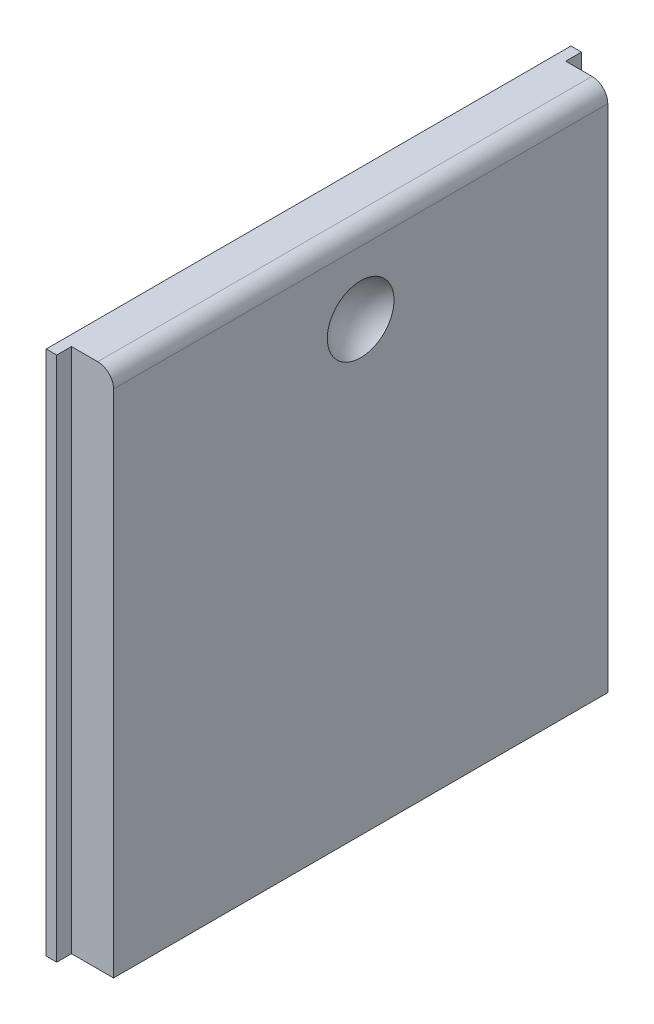
ISO-10303-21;
HEADER;
FILE_DESCRIPTION(('STEP AP214'),'2;1');
FILE_NAME('part.step','',(''),(''),'','','');
FILE_SCHEMA(('AUTOMOTIVE_DESIGN { 1 0 10303 214 1 1 1 1 }'));
ENDSEC;
DATA;
#1=APPLICATION_CONTEXT('core data for automotive mechanical design processes');
#2=APPLICATION_PROTOCOL_DEFINITION('international standard','automotive_design',2000,#1);
#3=PRODUCT_CONTEXT('',#1,'mechanical');
#4=PRODUCT('Part','Part','',(#3));
#5=PRODUCT_RELATED_PRODUCT_CATEGORY('part','',(#4));
#6=PRODUCT_DEFINITION_FORMATION('','',#4);
#7=PRODUCT_DEFINITION_CONTEXT('part definition',#1,'design');
#8=PRODUCT_DEFINITION('design','',#6,#7);
#9=PRODUCT_DEFINITION_SHAPE('','',#8);
#10=(LENGTH_UNIT() NAMED_UNIT(*) SI_UNIT(.MILLI.,.METRE.));
#11=(NAMED_UNIT(*) PLANE_ANGLE_UNIT() SI_UNIT($,.RADIAN.));
#12=(NAMED_UNIT(*) SI_UNIT($,.STERADIAN.) SOLID_ANGLE_UNIT());
#13=UNCERTAINTY_MEASURE_WITH_UNIT(LENGTH_MEASURE(1.E-05),#10,'distance_accuracy_value','');
#14=(GEOMETRIC_REPRESENTATION_CONTEXT(3) GLOBAL_UNCERTAINTY_ASSIGNED_CONTEXT((#13)) GLOBAL_UNIT_ASSIGNED_CONTEXT((#10,
#11,#12)) REPRESENTATION_CONTEXT('',''));
#15=CARTESIAN_POINT('',(0.,0.,0.));
#16=DIRECTION('',(0.,0.,1.));
#17=DIRECTION('',(1.,0.,0.));
#18=AXIS2_PLACEMENT_3D('',#15,#16,#17);
#19=CARTESIAN_POINT('',(0.,100.,47.));
#20=DIRECTION('',(-1.,0.,0.));
#21=DIRECTION('',(0.,0.,1.));
#22=AXIS2_PLACEMENT_3D('',#19,#20,#21);
#23=PLANE('',#22);
#24=CARTESIAN_POINT('',(0.,85.,0.));
#25=DIRECTION('',(-1.,0.,0.));
#26=DIRECTION('',(0.,0.,1.));
#27=AXIS2_PLACEMENT_3D('',#24,#25,#26);
#28=CIRCLE('',#27,6.34428877022475);
#29=CARTESIAN_POINT('',(0.,85.,6.34428877022475));
#30=VERTEX_POINT('',#29);
#31=EDGE_CURVE('E50',#30,#30,#28,.F.);
#32=ORIENTED_EDGE('',*,*,#31,.F.);
#33=EDGE_LOOP('',(#32));
#34=FACE_BOUND('',#33,.T.);
#35=DIRECTION('',(0.,-1.,0.));
#36=VECTOR('',#35,1.);
#37=CARTESIAN_POINT('',(0.,100.,-47.));
#38=LINE('',#37,#36);
#39=CARTESIAN_POINT('',(0.,97.,-47.));
#40=VERTEX_POINT('',#39);
#41=CARTESIAN_POINT('',(0.,0.,-47.));
#42=VERTEX_POINT('',#41);
#43=EDGE_CURVE('E136',#40,#42,#38,.T.);
#44=ORIENTED_EDGE('',*,*,#43,.F.);
#45=DIRECTION('',(0.,0.,-1.));
#46=VECTOR('',#45,1.);
#47=CARTESIAN_POINT('',(0.,97.,47.));
#48=LINE('',#47,#46);
#49=CARTESIAN_POINT('',(0.,97.,47.));
#50=VERTEX_POINT('',#49);
#51=EDGE_CURVE('E56',#40,#50,#48,.F.);
#52=ORIENTED_EDGE('',*,*,#51,.T.);
#53=DIRECTION('',(0.,-1.,0.));
#54=VECTOR('',#53,1.);
#55=CARTESIAN_POINT('',(0.,100.,47.));
#56=LINE('',#55,#54);
#57=CARTESIAN_POINT('',(0.,0.,47.));
#58=VERTEX_POINT('',#57);
#59=EDGE_CURVE('E162',#50,#58,#56,.T.);
#60=ORIENTED_EDGE('',*,*,#59,.T.);
#61=DIRECTION('',(0.,0.,-1.));
#62=VECTOR('',#61,1.);
#63=CARTESIAN_POINT('',(0.,0.,47.));
#64=LINE('',#63,#62);
#65=EDGE_CURVE('E163',#58,#42,#64,.T.);
#66=ORIENTED_EDGE('',*,*,#65,.T.);
#67=EDGE_LOOP('',(#44,#52,#60,#66));
#68=FACE_BOUND('',#67,.T.);
#69=ADVANCED_FACE('F46',(#34,#68),#23,.F.);
#70=CARTESIAN_POINT('',(0.,100.,-47.));
#71=DIRECTION('',(0.,0.,1.));
#72=DIRECTION('',(1.,0.,0.));
#73=AXIS2_PLACEMENT_3D('',#70,#71,#72);
#74=PLANE('',#73);
#75=DIRECTION('',(-1.,0.,0.));
#76=VECTOR('',#75,1.);
#77=CARTESIAN_POINT('',(0.,100.,-47.));
#78=LINE('',#77,#76);
#79=CARTESIAN_POINT('',(-3.,100.,-47.));
#80=VERTEX_POINT('',#79);
#81=CARTESIAN_POINT('',(-8.,100.,-47.));
#82=VERTEX_POINT('',#81);
#83=EDGE_CURVE('E116',#80,#82,#78,.T.);
#84=ORIENTED_EDGE('',*,*,#83,.F.);
#85=CARTESIAN_POINT('',(-3.,97.,-47.));
#86=DIRECTION('',(0.,0.,1.));
#87=DIRECTION('',(1.,0.,0.));
#88=AXIS2_PLACEMENT_3D('',#85,#86,#87);
#89=CIRCLE('',#88,3.);
#90=EDGE_CURVE('E70',#80,#40,#89,.F.);
#91=ORIENTED_EDGE('',*,*,#90,.T.);
#92=ORIENTED_EDGE('',*,*,#43,.T.);
#93=DIRECTION('',(-1.,0.,0.));
#94=VECTOR('',#93,1.);
#95=CARTESIAN_POINT('',(0.,0.,-47.));
#96=LINE('',#95,#94);
#97=CARTESIAN_POINT('',(-8.,0.,-47.));
#98=VERTEX_POINT('',#97);
#99=EDGE_CURVE('E132',#42,#98,#96,.T.);
#100=ORIENTED_EDGE('',*,*,#99,.T.);
#101=DIRECTION('',(0.,-1.,0.));
#102=VECTOR('',#101,1.);
#103=CARTESIAN_POINT('',(-8.,100.,-47.));
#104=LINE('',#103,#102);
#105=EDGE_CURVE('E129',#82,#98,#104,.T.);
#106=ORIENTED_EDGE('',*,*,#105,.F.);
#107=EDGE_LOOP('',(#84,#91,#92,#100,#106));
#108=FACE_BOUND('',#107,.T.);
#109=ADVANCED_FACE('F130',(#108),#74,.F.);
#110=CARTESIAN_POINT('',(-8.,100.,-47.));
#111=DIRECTION('',(-1.,0.,0.));
#112=DIRECTION('',(0.,0.,1.));
#113=AXIS2_PLACEMENT_3D('',#110,#111,#112);
#114=PLANE('',#113);
#115=DIRECTION('',(0.,0.,-1.));
#116=VECTOR('',#115,1.);
#117=CARTESIAN_POINT('',(-8.,0.,-47.));
#118=LINE('',#117,#116);
#119=CARTESIAN_POINT('',(-8.,0.,-50.));
#120=VERTEX_POINT('',#119);
#121=EDGE_CURVE('E169',#98,#120,#118,.T.);
#122=ORIENTED_EDGE('',*,*,#121,.T.);
#123=DIRECTION('',(0.,-1.,0.));
#124=VECTOR('',#123,1.);
#125=CARTESIAN_POINT('',(-8.,100.,-50.));
#126=LINE('',#125,#124);
#127=CARTESIAN_POINT('',(-8.,100.,-50.));
#128=VERTEX_POINT('',#127);
#129=EDGE_CURVE('E137',#128,#120,#126,.T.);
#130=ORIENTED_EDGE('',*,*,#129,.F.);
#131=DIRECTION('',(0.,0.,-1.));
#132=VECTOR('',#131,1.);
#133=CARTESIAN_POINT('',(-8.,100.,-47.));
#134=LINE('',#133,#132);
#135=EDGE_CURVE('E121',#82,#128,#134,.T.);
#136=ORIENTED_EDGE('',*,*,#135,.F.);
#137=ORIENTED_EDGE('',*,*,#105,.T.);
#138=EDGE_LOOP('',(#122,#130,#136,#137));
#139=FACE_BOUND('',#138,.T.);
#140=ADVANCED_FACE('F139',(#139),#114,.F.);
#141=CARTESIAN_POINT('',(-10.,100.,-50.));
#142=DIRECTION('',(0.,0.,1.));
#143=DIRECTION('',(1.,0.,0.));
#144=AXIS2_PLACEMENT_3D('',#141,#142,#143);
#145=PLANE('',#144);
#146=DIRECTION('',(-1.,0.,0.));
#147=VECTOR('',#146,1.);
#148=CARTESIAN_POINT('',(-10.,0.,-50.));
#149=LINE('',#148,#147);
#150=CARTESIAN_POINT('',(-10.,0.,-50.));
#151=VERTEX_POINT('',#150);
#152=EDGE_CURVE('E172',#120,#151,#149,.T.);
#153=ORIENTED_EDGE('',*,*,#152,.T.);
#154=DIRECTION('',(0.,-1.,0.));
#155=VECTOR('',#154,1.);
#156=CARTESIAN_POINT('',(-10.,100.,-50.));
#157=LINE('',#156,#155);
#158=CARTESIAN_POINT('',(-10.,100.,-50.));
#159=VERTEX_POINT('',#158);
#160=EDGE_CURVE('E202',#159,#151,#157,.T.);
#161=ORIENTED_EDGE('',*,*,#160,.F.);
#162=DIRECTION('',(-1.,0.,0.));
#163=VECTOR('',#162,1.);
#164=CARTESIAN_POINT('',(-10.,100.,-50.));
#165=LINE('',#164,#163);
#166=EDGE_CURVE('E143',#128,#159,#165,.T.);
#167=ORIENTED_EDGE('',*,*,#166,.F.);
#168=ORIENTED_EDGE('',*,*,#129,.T.);
#169=EDGE_LOOP('',(#153,#161,#167,#168));
#170=FACE_BOUND('',#169,.T.);
#171=ADVANCED_FACE('F295',(#170),#145,.F.);
#172=CARTESIAN_POINT('',(-9.99999999999998,100.,47.4));
#173=DIRECTION('',(1.,0.,0.));
#174=DIRECTION('',(0.,0.,-1.));
#175=AXIS2_PLACEMENT_3D('',#172,#173,#174);
#176=PLANE('',#175);
#177=DIRECTION('',(0.,0.,1.));
#178=VECTOR('',#177,1.);
#179=CARTESIAN_POINT('',(-9.99999999999998,0.,47.4));
#180=LINE('',#179,#178);
#181=CARTESIAN_POINT('',(-9.99999999999998,0.,49.8));
#182=VERTEX_POINT('',#181);
#183=EDGE_CURVE('E176',#151,#182,#180,.T.);
#184=ORIENTED_EDGE('',*,*,#183,.T.);
#185=DIRECTION('',(0.,-1.,0.));
#186=VECTOR('',#185,1.);
#187=CARTESIAN_POINT('',(-9.99999999999998,100.,49.8));
#188=LINE('',#187,#186);
#189=CARTESIAN_POINT('',(-9.99999999999998,100.,49.8));
#190=VERTEX_POINT('',#189);
#191=EDGE_CURVE('E198',#190,#182,#188,.T.);
#192=ORIENTED_EDGE('',*,*,#191,.F.);
#193=DIRECTION('',(0.,0.,1.));
#194=VECTOR('',#193,1.);
#195=CARTESIAN_POINT('',(-10.,100.,-47.6));
#196=LINE('',#195,#194);
#197=EDGE_CURVE('E148',#159,#190,#196,.T.);
#198=ORIENTED_EDGE('',*,*,#197,.F.);
#199=ORIENTED_EDGE('',*,*,#160,.T.);
#200=EDGE_LOOP('',(#184,#192,#198,#199));
#201=FACE_BOUND('',#200,.T.);
#202=ADVANCED_FACE('F300',(#201),#176,.F.);
#203=CARTESIAN_POINT('',(-9.99999999999998,100.,49.8));
#204=DIRECTION('',(0.,0.,-1.));
#205=DIRECTION('',(-1.,0.,0.));
#206=AXIS2_PLACEMENT_3D('',#203,#204,#205);
#207=PLANE('',#206);
#208=DIRECTION('',(1.,0.,0.));
#209=VECTOR('',#208,1.);
#210=CARTESIAN_POINT('',(-9.99999999999998,0.,49.8));
#211=LINE('',#210,#209);
#212=CARTESIAN_POINT('',(-7.99999999999998,0.,49.8));
#213=VERTEX_POINT('',#212);
#214=EDGE_CURVE('E179',#182,#213,#211,.T.);
#215=ORIENTED_EDGE('',*,*,#214,.T.);
#216=DIRECTION('',(0.,-1.,0.));
#217=VECTOR('',#216,1.);
#218=CARTESIAN_POINT('',(-7.99999999999998,100.,49.8));
#219=LINE('',#218,#217);
#220=CARTESIAN_POINT('',(-7.99999999999998,100.,49.8));
#221=VERTEX_POINT('',#220);
#222=EDGE_CURVE('E194',#221,#213,#219,.T.);
#223=ORIENTED_EDGE('',*,*,#222,.F.);
#224=DIRECTION('',(1.,0.,0.));
#225=VECTOR('',#224,1.);
#226=CARTESIAN_POINT('',(-9.99999999999998,100.,49.8));
#227=LINE('',#226,#225);
#228=EDGE_CURVE('E153',#190,#221,#227,.T.);
#229=ORIENTED_EDGE('',*,*,#228,.F.);
#230=ORIENTED_EDGE('',*,*,#191,.T.);
#231=EDGE_LOOP('',(#215,#223,#229,#230));
#232=FACE_BOUND('',#231,.T.);
#233=ADVANCED_FACE('F302',(#232),#207,.F.);
#234=CARTESIAN_POINT('',(-8.,100.,47.));
#235=DIRECTION('',(-1.,0.,0.));
#236=DIRECTION('',(0.,0.,1.));
#237=AXIS2_PLACEMENT_3D('',#234,#235,#236);
#238=PLANE('',#237);
#239=DIRECTION('',(0.,0.,-1.));
#240=VECTOR('',#239,1.);
#241=CARTESIAN_POINT('',(-8.,0.,47.));
#242=LINE('',#241,#240);
#243=CARTESIAN_POINT('',(-8.,0.,47.));
#244=VERTEX_POINT('',#243);
#245=EDGE_CURVE('E182',#213,#244,#242,.T.);
#246=ORIENTED_EDGE('',*,*,#245,.T.);
#247=DIRECTION('',(0.,-1.,0.));
#248=VECTOR('',#247,1.);
#249=CARTESIAN_POINT('',(-8.,100.,47.));
#250=LINE('',#249,#248);
#251=CARTESIAN_POINT('',(-8.,100.,47.));
#252=VERTEX_POINT('',#251);
#253=EDGE_CURVE('E190',#252,#244,#250,.T.);
#254=ORIENTED_EDGE('',*,*,#253,.F.);
#255=DIRECTION('',(0.,0.,-1.));
#256=VECTOR('',#255,1.);
#257=CARTESIAN_POINT('',(-8.,100.,47.));
#258=LINE('',#257,#256);
#259=EDGE_CURVE('E156',#221,#252,#258,.T.);
#260=ORIENTED_EDGE('',*,*,#259,.F.);
#261=ORIENTED_EDGE('',*,*,#222,.T.);
#262=EDGE_LOOP('',(#246,#254,#260,#261));
#263=FACE_BOUND('',#262,.T.);
#264=ADVANCED_FACE('F287',(#263),#238,.F.);
#265=CARTESIAN_POINT('',(0.,100.,47.));
#266=DIRECTION('',(0.,0.,-1.));
#267=DIRECTION('',(-1.,0.,0.));
#268=AXIS2_PLACEMENT_3D('',#265,#266,#267);
#269=PLANE('',#268);
#270=ORIENTED_EDGE('',*,*,#59,.F.);
#271=CARTESIAN_POINT('',(-3.,97.,47.));
#272=DIRECTION('',(0.,0.,-1.));
#273=DIRECTION('',(-1.,0.,0.));
#274=AXIS2_PLACEMENT_3D('',#271,#272,#273);
#275=CIRCLE('',#274,3.);
#276=CARTESIAN_POINT('',(-3.,100.,47.));
#277=VERTEX_POINT('',#276);
#278=EDGE_CURVE('E11',#50,#277,#275,.F.);
#279=ORIENTED_EDGE('',*,*,#278,.T.);
#280=DIRECTION('',(1.,0.,0.));
#281=VECTOR('',#280,1.);
#282=CARTESIAN_POINT('',(0.,100.,47.));
#283=LINE('',#282,#281);
#284=EDGE_CURVE('E159',#252,#277,#283,.T.);
#285=ORIENTED_EDGE('',*,*,#284,.F.);
#286=ORIENTED_EDGE('',*,*,#253,.T.);
#287=DIRECTION('',(1.,0.,0.));
#288=VECTOR('',#287,1.);
#289=CARTESIAN_POINT('',(0.,0.,47.));
#290=LINE('',#289,#288);
#291=EDGE_CURVE('E126',#244,#58,#290,.T.);
#292=ORIENTED_EDGE('',*,*,#291,.T.);
#293=EDGE_LOOP('',(#270,#279,#285,#286,#292));
#294=FACE_BOUND('',#293,.T.);
#295=ADVANCED_FACE('F281',(#294),#269,.F.);
#296=CARTESIAN_POINT('',(0.,100.,0.));
#297=DIRECTION('',(0.,1.,0.));
#298=DIRECTION('',(0.,0.,1.));
#299=AXIS2_PLACEMENT_3D('',#296,#297,#298);
#300=PLANE('',#299);
#301=ORIENTED_EDGE('',*,*,#284,.T.);
#302=DIRECTION('',(0.,0.,-1.));
#303=VECTOR('',#302,1.);
#304=CARTESIAN_POINT('',(-3.,100.,-47.));
#305=LINE('',#304,#303);
#306=EDGE_CURVE('E124',#277,#80,#305,.T.);
#307=ORIENTED_EDGE('',*,*,#306,.T.);
#308=ORIENTED_EDGE('',*,*,#83,.T.);
#309=ORIENTED_EDGE('',*,*,#135,.T.);
#310=ORIENTED_EDGE('',*,*,#166,.T.);
#311=ORIENTED_EDGE('',*,*,#197,.T.);
#312=ORIENTED_EDGE('',*,*,#228,.T.);
#313=ORIENTED_EDGE('',*,*,#259,.T.);
#314=EDGE_LOOP('',(#301,#307,#308,#309,#310,#311,#312,#313));
#315=FACE_BOUND('',#314,.T.);
#316=ADVANCED_FACE('F119',(#315),#300,.T.);
#317=CARTESIAN_POINT('',(0.,0.,0.));
#318=DIRECTION('',(0.,1.,0.));
#319=DIRECTION('',(0.,0.,1.));
#320=AXIS2_PLACEMENT_3D('',#317,#318,#319);
#321=PLANE('',#320);
#322=ORIENTED_EDGE('',*,*,#65,.F.);
#323=ORIENTED_EDGE('',*,*,#291,.F.);
#324=ORIENTED_EDGE('',*,*,#245,.F.);
#325=ORIENTED_EDGE('',*,*,#214,.F.);
#326=ORIENTED_EDGE('',*,*,#183,.F.);
#327=ORIENTED_EDGE('',*,*,#152,.F.);
#328=ORIENTED_EDGE('',*,*,#121,.F.);
#329=ORIENTED_EDGE('',*,*,#99,.F.);
#330=EDGE_LOOP('',(#322,#323,#324,#325,#326,#327,#328,#329));
#331=FACE_BOUND('',#330,.T.);
#332=ADVANCED_FACE('F291',(#331),#321,.F.);
#333=CARTESIAN_POINT('',(-3.,97.,0.));
#334=DIRECTION('',(0.,0.,1.));
#335=DIRECTION('',(1.,0.,0.));
#336=AXIS2_PLACEMENT_3D('',#333,#334,#335);
#337=CYLINDRICAL_SURFACE('',#336,3.);
#338=ORIENTED_EDGE('',*,*,#278,.F.);
#339=ORIENTED_EDGE('',*,*,#51,.F.);
#340=ORIENTED_EDGE('',*,*,#90,.F.);
#341=ORIENTED_EDGE('',*,*,#306,.F.);
#342=EDGE_LOOP('',(#338,#339,#340,#341));
#343=FACE_BOUND('',#342,.T.);
#344=ADVANCED_FACE('F48',(#343),#337,.T.);
#345=CARTESIAN_POINT('',(4.00000000000002,85.,0.));
#346=DIRECTION('',(-1.,0.,0.));
#347=DIRECTION('',(0.,1.,0.));
#348=AXIS2_PLACEMENT_3D('',#345,#346,#347);
#349=SPHERICAL_SURFACE('',#348,7.5);
#350=ORIENTED_EDGE('',*,*,#31,.T.);
#351=EDGE_LOOP('',(#350));
#352=FACE_BOUND('',#351,.T.);
#353=ADVANCED_FACE('F273',(#352),#349,.F.);
#354=CLOSED_SHELL('',(#69,#109,#140,#171,#202,#233,#264,#295,#316,#332,#344,#353));
#355=MANIFOLD_SOLID_BREP('B2',#354);
#356=ADVANCED_BREP_SHAPE_REPRESENTATION('',(#18,#355),#14);
#357=SHAPE_DEFINITION_REPRESENTATION(#9,#356);
ENDSEC;
END-ISO-10303-21;
